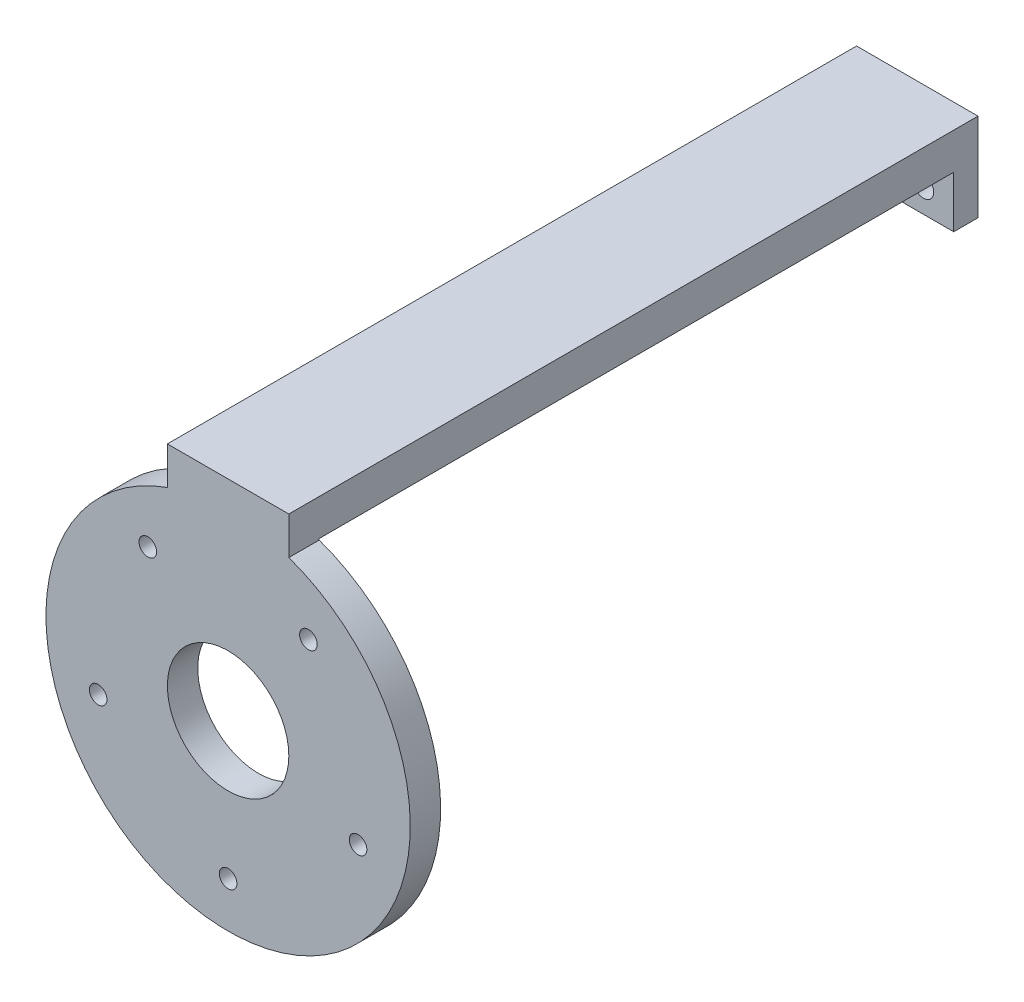
ISO-10303-21;
HEADER;
FILE_DESCRIPTION(('STEP AP214'),'2;1');
FILE_NAME('part.step','',(''),(''),'','','');
FILE_SCHEMA(('AUTOMOTIVE_DESIGN { 1 0 10303 214 1 1 1 1 }'));
ENDSEC;
DATA;
#1=APPLICATION_CONTEXT('core data for automotive mechanical design processes');
#2=APPLICATION_PROTOCOL_DEFINITION('international standard','automotive_design',2000,#1);
#3=PRODUCT_CONTEXT('',#1,'mechanical');
#4=PRODUCT('Part','Part','',(#3));
#5=PRODUCT_RELATED_PRODUCT_CATEGORY('part','',(#4));
#6=PRODUCT_DEFINITION_FORMATION('','',#4);
#7=PRODUCT_DEFINITION_CONTEXT('part definition',#1,'design');
#8=PRODUCT_DEFINITION('design','',#6,#7);
#9=PRODUCT_DEFINITION_SHAPE('','',#8);
#10=(LENGTH_UNIT() NAMED_UNIT(*) SI_UNIT(.MILLI.,.METRE.));
#11=(NAMED_UNIT(*) PLANE_ANGLE_UNIT() SI_UNIT($,.RADIAN.));
#12=(NAMED_UNIT(*) SI_UNIT($,.STERADIAN.) SOLID_ANGLE_UNIT());
#13=UNCERTAINTY_MEASURE_WITH_UNIT(LENGTH_MEASURE(1.E-05),#10,'distance_accuracy_value','');
#14=(GEOMETRIC_REPRESENTATION_CONTEXT(3) GLOBAL_UNCERTAINTY_ASSIGNED_CONTEXT((#13)) GLOBAL_UNIT_ASSIGNED_CONTEXT((#10,
#11,#12)) REPRESENTATION_CONTEXT('',''));
#15=CARTESIAN_POINT('',(0.,0.,0.));
#16=DIRECTION('',(0.,0.,1.));
#17=DIRECTION('',(1.,0.,0.));
#18=AXIS2_PLACEMENT_3D('',#15,#16,#17);
#19=CARTESIAN_POINT('',(300.,300.,389.5));
#20=DIRECTION('',(0.,0.,-1.));
#21=DIRECTION('',(-1.,0.,0.));
#22=AXIS2_PLACEMENT_3D('',#19,#20,#21);
#23=CYLINDRICAL_SURFACE('',#22,30.);
#24=DIRECTION('',(0.,0.,-1.));
#25=VECTOR('',#24,1.);
#26=CARTESIAN_POINT('',(290.,328.284271247462,389.5));
#27=LINE('',#26,#25);
#28=CARTESIAN_POINT('',(290.,328.284271247462,384.5));
#29=VERTEX_POINT('',#28);
#30=CARTESIAN_POINT('',(290.,328.284271247462,389.5));
#31=VERTEX_POINT('',#30);
#32=EDGE_CURVE('E46',#29,#31,#27,.F.);
#33=ORIENTED_EDGE('',*,*,#32,.F.);
#34=CARTESIAN_POINT('',(300.,300.,384.5));
#35=DIRECTION('',(0.,0.,1.));
#36=DIRECTION('',(1.,0.,0.));
#37=AXIS2_PLACEMENT_3D('',#34,#35,#36);
#38=CIRCLE('',#37,30.);
#39=CARTESIAN_POINT('',(310.,328.284271247462,384.5));
#40=VERTEX_POINT('',#39);
#41=EDGE_CURVE('E61',#29,#40,#38,.T.);
#42=ORIENTED_EDGE('',*,*,#41,.T.);
#43=DIRECTION('',(0.,0.,-1.));
#44=VECTOR('',#43,1.);
#45=CARTESIAN_POINT('',(310.,328.284271247462,389.5));
#46=LINE('',#45,#44);
#47=CARTESIAN_POINT('',(310.,328.284271247462,389.5));
#48=VERTEX_POINT('',#47);
#49=EDGE_CURVE('E198',#48,#40,#46,.T.);
#50=ORIENTED_EDGE('',*,*,#49,.F.);
#51=CARTESIAN_POINT('',(300.,300.,389.5));
#52=DIRECTION('',(0.,0.,1.));
#53=DIRECTION('',(1.,0.,0.));
#54=AXIS2_PLACEMENT_3D('',#51,#52,#53);
#55=CIRCLE('',#54,30.);
#56=EDGE_CURVE('E195',#31,#48,#55,.T.);
#57=ORIENTED_EDGE('',*,*,#56,.F.);
#58=EDGE_LOOP('',(#33,#42,#50,#57));
#59=FACE_BOUND('',#58,.T.);
#60=ADVANCED_FACE('F39',(#59),#23,.T.);
#61=CARTESIAN_POINT('',(300.,300.,389.5));
#62=DIRECTION('',(0.,0.,1.));
#63=DIRECTION('',(1.,0.,0.));
#64=AXIS2_PLACEMENT_3D('',#61,#62,#63);
#65=PLANE('',#64);
#66=DIRECTION('',(0.,1.,0.));
#67=VECTOR('',#66,1.);
#68=CARTESIAN_POINT('',(310.,320.,389.5));
#69=LINE('',#68,#67);
#70=CARTESIAN_POINT('',(310.,334.5,389.5));
#71=VERTEX_POINT('',#70);
#72=EDGE_CURVE('E147',#48,#71,#69,.T.);
#73=ORIENTED_EDGE('',*,*,#72,.T.);
#74=DIRECTION('',(-1.,0.,0.));
#75=VECTOR('',#74,1.);
#76=CARTESIAN_POINT('',(310.,334.5,389.5));
#77=LINE('',#76,#75);
#78=CARTESIAN_POINT('',(290.,334.5,389.5));
#79=VERTEX_POINT('',#78);
#80=EDGE_CURVE('E150',#71,#79,#77,.T.);
#81=ORIENTED_EDGE('',*,*,#80,.T.);
#82=DIRECTION('',(0.,-1.,0.));
#83=VECTOR('',#82,1.);
#84=CARTESIAN_POINT('',(290.,334.5,389.5));
#85=LINE('',#84,#83);
#86=EDGE_CURVE('E145',#79,#31,#85,.T.);
#87=ORIENTED_EDGE('',*,*,#86,.T.);
#88=ORIENTED_EDGE('',*,*,#56,.T.);
#89=EDGE_LOOP('',(#73,#81,#87,#88));
#90=FACE_BOUND('',#89,.T.);
#91=CARTESIAN_POINT('',(321.398771616641,293.047117626564,389.5));
#92=DIRECTION('',(0.,0.,1.));
#93=DIRECTION('',(1.,0.,0.));
#94=AXIS2_PLACEMENT_3D('',#91,#92,#93);
#95=CIRCLE('',#94,1.45000000000001);
#96=CARTESIAN_POINT('',(322.848771616641,293.047117626564,389.5));
#97=VERTEX_POINT('',#96);
#98=EDGE_CURVE('E166',#97,#97,#95,.T.);
#99=ORIENTED_EDGE('',*,*,#98,.F.);
#100=EDGE_LOOP('',(#99));
#101=FACE_BOUND('',#100,.T.);
#102=CARTESIAN_POINT('',(278.601228383359,293.047117626564,389.5));
#103=DIRECTION('',(0.,0.,1.));
#104=DIRECTION('',(1.,0.,0.));
#105=AXIS2_PLACEMENT_3D('',#102,#103,#104);
#106=CIRCLE('',#105,1.45000000000001);
#107=CARTESIAN_POINT('',(280.051228383359,293.047117626564,389.5));
#108=VERTEX_POINT('',#107);
#109=EDGE_CURVE('E178',#108,#108,#106,.T.);
#110=ORIENTED_EDGE('',*,*,#109,.F.);
#111=EDGE_LOOP('',(#110));
#112=FACE_BOUND('',#111,.T.);
#113=CARTESIAN_POINT('',(300.,300.,389.5));
#114=DIRECTION('',(0.,0.,1.));
#115=DIRECTION('',(1.,0.,0.));
#116=AXIS2_PLACEMENT_3D('',#113,#114,#115);
#117=CIRCLE('',#116,10.);
#118=CARTESIAN_POINT('',(310.,300.,389.5));
#119=VERTEX_POINT('',#118);
#120=EDGE_CURVE('E190',#119,#119,#117,.T.);
#121=ORIENTED_EDGE('',*,*,#120,.F.);
#122=EDGE_LOOP('',(#121));
#123=FACE_BOUND('',#122,.T.);
#124=CARTESIAN_POINT('',(286.774831823419,318.202882373436,389.5));
#125=DIRECTION('',(0.,0.,1.));
#126=DIRECTION('',(1.,0.,0.));
#127=AXIS2_PLACEMENT_3D('',#124,#125,#126);
#128=CIRCLE('',#127,1.45000000000001);
#129=CARTESIAN_POINT('',(288.224831823419,318.202882373436,389.5));
#130=VERTEX_POINT('',#129);
#131=EDGE_CURVE('E184',#130,#130,#128,.T.);
#132=ORIENTED_EDGE('',*,*,#131,.F.);
#133=EDGE_LOOP('',(#132));
#134=FACE_BOUND('',#133,.T.);
#135=CARTESIAN_POINT('',(300.,277.5,389.5));
#136=DIRECTION('',(0.,0.,1.));
#137=DIRECTION('',(1.,0.,0.));
#138=AXIS2_PLACEMENT_3D('',#135,#136,#137);
#139=CIRCLE('',#138,1.45000000000001);
#140=CARTESIAN_POINT('',(301.45,277.5,389.5));
#141=VERTEX_POINT('',#140);
#142=EDGE_CURVE('E172',#141,#141,#139,.T.);
#143=ORIENTED_EDGE('',*,*,#142,.F.);
#144=EDGE_LOOP('',(#143));
#145=FACE_BOUND('',#144,.T.);
#146=CARTESIAN_POINT('',(313.225168176581,318.202882373436,389.5));
#147=DIRECTION('',(0.,0.,1.));
#148=DIRECTION('',(1.,0.,0.));
#149=AXIS2_PLACEMENT_3D('',#146,#147,#148);
#150=CIRCLE('',#149,1.45000000000001);
#151=CARTESIAN_POINT('',(314.675168176581,318.202882373436,389.5));
#152=VERTEX_POINT('',#151);
#153=EDGE_CURVE('E160',#152,#152,#150,.T.);
#154=ORIENTED_EDGE('',*,*,#153,.F.);
#155=EDGE_LOOP('',(#154));
#156=FACE_BOUND('',#155,.T.);
#157=ADVANCED_FACE('F206',(#90,#101,#112,#123,#134,#145,#156),#65,.T.);
#158=CARTESIAN_POINT('',(300.,300.,384.5));
#159=DIRECTION('',(0.,0.,1.));
#160=DIRECTION('',(1.,0.,0.));
#161=AXIS2_PLACEMENT_3D('',#158,#159,#160);
#162=PLANE('',#161);
#163=DIRECTION('',(0.,-1.,0.));
#164=VECTOR('',#163,1.);
#165=CARTESIAN_POINT('',(290.,334.5,384.5));
#166=LINE('',#165,#164);
#167=CARTESIAN_POINT('',(290.,328.5,384.5));
#168=VERTEX_POINT('',#167);
#169=EDGE_CURVE('E144',#168,#29,#166,.T.);
#170=ORIENTED_EDGE('',*,*,#169,.F.);
#171=DIRECTION('',(1.,0.,0.));
#172=VECTOR('',#171,1.);
#173=CARTESIAN_POINT('',(300.,328.5,384.5));
#174=LINE('',#173,#172);
#175=CARTESIAN_POINT('',(310.,328.5,384.5));
#176=VERTEX_POINT('',#175);
#177=EDGE_CURVE('E142',#168,#176,#174,.T.);
#178=ORIENTED_EDGE('',*,*,#177,.T.);
#179=DIRECTION('',(0.,1.,0.));
#180=VECTOR('',#179,1.);
#181=CARTESIAN_POINT('',(310.,320.,384.5));
#182=LINE('',#181,#180);
#183=EDGE_CURVE('E148',#40,#176,#182,.T.);
#184=ORIENTED_EDGE('',*,*,#183,.F.);
#185=ORIENTED_EDGE('',*,*,#41,.F.);
#186=EDGE_LOOP('',(#170,#178,#184,#185));
#187=FACE_BOUND('',#186,.T.);
#188=CARTESIAN_POINT('',(313.225168176581,318.202882373436,384.5));
#189=DIRECTION('',(0.,0.,1.));
#190=DIRECTION('',(1.,0.,0.));
#191=AXIS2_PLACEMENT_3D('',#188,#189,#190);
#192=CIRCLE('',#191,1.45000000000001);
#193=CARTESIAN_POINT('',(314.675168176581,318.202882373436,384.5));
#194=VERTEX_POINT('',#193);
#195=EDGE_CURVE('E159',#194,#194,#192,.T.);
#196=ORIENTED_EDGE('',*,*,#195,.T.);
#197=EDGE_LOOP('',(#196));
#198=FACE_BOUND('',#197,.T.);
#199=CARTESIAN_POINT('',(321.398771616641,293.047117626564,384.5));
#200=DIRECTION('',(0.,0.,1.));
#201=DIRECTION('',(1.,0.,0.));
#202=AXIS2_PLACEMENT_3D('',#199,#200,#201);
#203=CIRCLE('',#202,1.45000000000001);
#204=CARTESIAN_POINT('',(322.848771616641,293.047117626564,384.5));
#205=VERTEX_POINT('',#204);
#206=EDGE_CURVE('E163',#205,#205,#203,.T.);
#207=ORIENTED_EDGE('',*,*,#206,.T.);
#208=EDGE_LOOP('',(#207));
#209=FACE_BOUND('',#208,.T.);
#210=CARTESIAN_POINT('',(300.,277.5,384.5));
#211=DIRECTION('',(0.,0.,1.));
#212=DIRECTION('',(1.,0.,0.));
#213=AXIS2_PLACEMENT_3D('',#210,#211,#212);
#214=CIRCLE('',#213,1.45000000000001);
#215=CARTESIAN_POINT('',(301.45,277.5,384.5));
#216=VERTEX_POINT('',#215);
#217=EDGE_CURVE('E169',#216,#216,#214,.T.);
#218=ORIENTED_EDGE('',*,*,#217,.T.);
#219=EDGE_LOOP('',(#218));
#220=FACE_BOUND('',#219,.T.);
#221=CARTESIAN_POINT('',(278.601228383359,293.047117626564,384.5));
#222=DIRECTION('',(0.,0.,1.));
#223=DIRECTION('',(1.,0.,0.));
#224=AXIS2_PLACEMENT_3D('',#221,#222,#223);
#225=CIRCLE('',#224,1.45000000000001);
#226=CARTESIAN_POINT('',(280.051228383359,293.047117626564,384.5));
#227=VERTEX_POINT('',#226);
#228=EDGE_CURVE('E175',#227,#227,#225,.T.);
#229=ORIENTED_EDGE('',*,*,#228,.T.);
#230=EDGE_LOOP('',(#229));
#231=FACE_BOUND('',#230,.T.);
#232=CARTESIAN_POINT('',(286.774831823419,318.202882373436,384.5));
#233=DIRECTION('',(0.,0.,1.));
#234=DIRECTION('',(1.,0.,0.));
#235=AXIS2_PLACEMENT_3D('',#232,#233,#234);
#236=CIRCLE('',#235,1.45000000000001);
#237=CARTESIAN_POINT('',(288.224831823419,318.202882373436,384.5));
#238=VERTEX_POINT('',#237);
#239=EDGE_CURVE('E181',#238,#238,#236,.T.);
#240=ORIENTED_EDGE('',*,*,#239,.T.);
#241=EDGE_LOOP('',(#240));
#242=FACE_BOUND('',#241,.T.);
#243=CARTESIAN_POINT('',(300.,300.,384.5));
#244=DIRECTION('',(0.,0.,1.));
#245=DIRECTION('',(1.,0.,0.));
#246=AXIS2_PLACEMENT_3D('',#243,#244,#245);
#247=CIRCLE('',#246,10.);
#248=CARTESIAN_POINT('',(310.,300.,384.5));
#249=VERTEX_POINT('',#248);
#250=EDGE_CURVE('E187',#249,#249,#247,.T.);
#251=ORIENTED_EDGE('',*,*,#250,.T.);
#252=EDGE_LOOP('',(#251));
#253=FACE_BOUND('',#252,.T.);
#254=ADVANCED_FACE('F256',(#187,#198,#209,#220,#231,#242,#253),#162,.F.);
#255=CARTESIAN_POINT('',(300.,300.,389.5));
#256=DIRECTION('',(0.,0.,-1.));
#257=DIRECTION('',(-1.,0.,0.));
#258=AXIS2_PLACEMENT_3D('',#255,#256,#257);
#259=CYLINDRICAL_SURFACE('',#258,10.);
#260=ORIENTED_EDGE('',*,*,#120,.T.);
#261=EDGE_LOOP('',(#260));
#262=FACE_BOUND('',#261,.T.);
#263=ORIENTED_EDGE('',*,*,#250,.F.);
#264=EDGE_LOOP('',(#263));
#265=FACE_BOUND('',#264,.T.);
#266=ADVANCED_FACE('F261',(#262,#265),#259,.F.);
#267=CARTESIAN_POINT('',(286.774831823419,318.202882373436,389.5));
#268=DIRECTION('',(0.,0.,-1.));
#269=DIRECTION('',(-1.,0.,0.));
#270=AXIS2_PLACEMENT_3D('',#267,#268,#269);
#271=CYLINDRICAL_SURFACE('',#270,1.45000000000001);
#272=ORIENTED_EDGE('',*,*,#131,.T.);
#273=EDGE_LOOP('',(#272));
#274=FACE_BOUND('',#273,.T.);
#275=ORIENTED_EDGE('',*,*,#239,.F.);
#276=EDGE_LOOP('',(#275));
#277=FACE_BOUND('',#276,.T.);
#278=ADVANCED_FACE('F266',(#274,#277),#271,.F.);
#279=CARTESIAN_POINT('',(278.601228383359,293.047117626564,389.5));
#280=DIRECTION('',(0.,0.,-1.));
#281=DIRECTION('',(-1.,0.,0.));
#282=AXIS2_PLACEMENT_3D('',#279,#280,#281);
#283=CYLINDRICAL_SURFACE('',#282,1.45000000000001);
#284=ORIENTED_EDGE('',*,*,#109,.T.);
#285=EDGE_LOOP('',(#284));
#286=FACE_BOUND('',#285,.T.);
#287=ORIENTED_EDGE('',*,*,#228,.F.);
#288=EDGE_LOOP('',(#287));
#289=FACE_BOUND('',#288,.T.);
#290=ADVANCED_FACE('F270',(#286,#289),#283,.F.);
#291=CARTESIAN_POINT('',(300.,277.5,389.5));
#292=DIRECTION('',(0.,0.,-1.));
#293=DIRECTION('',(-1.,0.,0.));
#294=AXIS2_PLACEMENT_3D('',#291,#292,#293);
#295=CYLINDRICAL_SURFACE('',#294,1.45000000000001);
#296=ORIENTED_EDGE('',*,*,#142,.T.);
#297=EDGE_LOOP('',(#296));
#298=FACE_BOUND('',#297,.T.);
#299=ORIENTED_EDGE('',*,*,#217,.F.);
#300=EDGE_LOOP('',(#299));
#301=FACE_BOUND('',#300,.T.);
#302=ADVANCED_FACE('F274',(#298,#301),#295,.F.);
#303=CARTESIAN_POINT('',(321.398771616641,293.047117626564,389.5));
#304=DIRECTION('',(0.,0.,-1.));
#305=DIRECTION('',(-1.,0.,0.));
#306=AXIS2_PLACEMENT_3D('',#303,#304,#305);
#307=CYLINDRICAL_SURFACE('',#306,1.45000000000001);
#308=ORIENTED_EDGE('',*,*,#98,.T.);
#309=EDGE_LOOP('',(#308));
#310=FACE_BOUND('',#309,.T.);
#311=ORIENTED_EDGE('',*,*,#206,.F.);
#312=EDGE_LOOP('',(#311));
#313=FACE_BOUND('',#312,.T.);
#314=ADVANCED_FACE('F278',(#310,#313),#307,.F.);
#315=CARTESIAN_POINT('',(313.225168176581,318.202882373436,389.5));
#316=DIRECTION('',(0.,0.,-1.));
#317=DIRECTION('',(-1.,0.,0.));
#318=AXIS2_PLACEMENT_3D('',#315,#316,#317);
#319=CYLINDRICAL_SURFACE('',#318,1.45000000000001);
#320=ORIENTED_EDGE('',*,*,#153,.T.);
#321=EDGE_LOOP('',(#320));
#322=FACE_BOUND('',#321,.T.);
#323=ORIENTED_EDGE('',*,*,#195,.F.);
#324=EDGE_LOOP('',(#323));
#325=FACE_BOUND('',#324,.T.);
#326=ADVANCED_FACE('F282',(#322,#325),#319,.F.);
#327=CARTESIAN_POINT('',(290.,334.5,389.5));
#328=DIRECTION('',(1.,0.,0.));
#329=DIRECTION('',(0.,0.,-1.));
#330=AXIS2_PLACEMENT_3D('',#327,#328,#329);
#331=PLANE('',#330);
#332=DIRECTION('',(0.,0.,-1.));
#333=VECTOR('',#332,1.);
#334=CARTESIAN_POINT('',(290.,334.5,389.5));
#335=LINE('',#334,#333);
#336=CARTESIAN_POINT('',(290.,334.5,276.));
#337=VERTEX_POINT('',#336);
#338=EDGE_CURVE('E152',#79,#337,#335,.T.);
#339=ORIENTED_EDGE('',*,*,#338,.T.);
#340=DIRECTION('',(0.,-1.,0.));
#341=VECTOR('',#340,1.);
#342=CARTESIAN_POINT('',(290.,334.5,276.));
#343=LINE('',#342,#341);
#344=CARTESIAN_POINT('',(290.,320.,276.));
#345=VERTEX_POINT('',#344);
#346=EDGE_CURVE('E127',#337,#345,#343,.T.);
#347=ORIENTED_EDGE('',*,*,#346,.T.);
#348=DIRECTION('',(0.,0.,-1.));
#349=VECTOR('',#348,1.);
#350=CARTESIAN_POINT('',(290.,320.,280.));
#351=LINE('',#350,#349);
#352=CARTESIAN_POINT('',(290.,320.,280.));
#353=VERTEX_POINT('',#352);
#354=EDGE_CURVE('E119',#353,#345,#351,.T.);
#355=ORIENTED_EDGE('',*,*,#354,.F.);
#356=DIRECTION('',(0.,-1.,0.));
#357=VECTOR('',#356,1.);
#358=CARTESIAN_POINT('',(290.,334.5,280.));
#359=LINE('',#358,#357);
#360=CARTESIAN_POINT('',(290.,328.5,280.));
#361=VERTEX_POINT('',#360);
#362=EDGE_CURVE('E104',#361,#353,#359,.T.);
#363=ORIENTED_EDGE('',*,*,#362,.F.);
#364=DIRECTION('',(0.,0.,1.));
#365=VECTOR('',#364,1.);
#366=CARTESIAN_POINT('',(290.,328.5,389.5));
#367=LINE('',#366,#365);
#368=EDGE_CURVE('E129',#361,#168,#367,.T.);
#369=ORIENTED_EDGE('',*,*,#368,.T.);
#370=ORIENTED_EDGE('',*,*,#169,.T.);
#371=ORIENTED_EDGE('',*,*,#32,.T.);
#372=ORIENTED_EDGE('',*,*,#86,.F.);
#373=EDGE_LOOP('',(#339,#347,#355,#363,#369,#370,#371,#372));
#374=FACE_BOUND('',#373,.T.);
#375=ADVANCED_FACE('F125',(#374),#331,.F.);
#376=CARTESIAN_POINT('',(310.,320.,389.5));
#377=DIRECTION('',(-1.,0.,0.));
#378=DIRECTION('',(0.,0.,1.));
#379=AXIS2_PLACEMENT_3D('',#376,#377,#378);
#380=PLANE('',#379);
#381=DIRECTION('',(0.,0.,-1.));
#382=VECTOR('',#381,1.);
#383=CARTESIAN_POINT('',(310.,328.5,276.));
#384=LINE('',#383,#382);
#385=CARTESIAN_POINT('',(310.,328.5,280.));
#386=VERTEX_POINT('',#385);
#387=EDGE_CURVE('E53',#176,#386,#384,.T.);
#388=ORIENTED_EDGE('',*,*,#387,.T.);
#389=DIRECTION('',(0.,1.,0.));
#390=VECTOR('',#389,1.);
#391=CARTESIAN_POINT('',(310.,320.,280.));
#392=LINE('',#391,#390);
#393=CARTESIAN_POINT('',(310.,320.,280.));
#394=VERTEX_POINT('',#393);
#395=EDGE_CURVE('E123',#394,#386,#392,.T.);
#396=ORIENTED_EDGE('',*,*,#395,.F.);
#397=DIRECTION('',(0.,0.,-1.));
#398=VECTOR('',#397,1.);
#399=CARTESIAN_POINT('',(310.,320.,280.));
#400=LINE('',#399,#398);
#401=CARTESIAN_POINT('',(310.,320.,276.));
#402=VERTEX_POINT('',#401);
#403=EDGE_CURVE('E121',#394,#402,#400,.T.);
#404=ORIENTED_EDGE('',*,*,#403,.T.);
#405=DIRECTION('',(0.,-1.,0.));
#406=VECTOR('',#405,1.);
#407=CARTESIAN_POINT('',(310.,334.5,276.));
#408=LINE('',#407,#406);
#409=CARTESIAN_POINT('',(310.,334.5,276.));
#410=VERTEX_POINT('',#409);
#411=EDGE_CURVE('E140',#410,#402,#408,.T.);
#412=ORIENTED_EDGE('',*,*,#411,.F.);
#413=DIRECTION('',(0.,0.,-1.));
#414=VECTOR('',#413,1.);
#415=CARTESIAN_POINT('',(310.,334.5,389.5));
#416=LINE('',#415,#414);
#417=EDGE_CURVE('E157',#71,#410,#416,.T.);
#418=ORIENTED_EDGE('',*,*,#417,.F.);
#419=ORIENTED_EDGE('',*,*,#72,.F.);
#420=ORIENTED_EDGE('',*,*,#49,.T.);
#421=ORIENTED_EDGE('',*,*,#183,.T.);
#422=EDGE_LOOP('',(#388,#396,#404,#412,#418,#419,#420,#421));
#423=FACE_BOUND('',#422,.T.);
#424=ADVANCED_FACE('F210',(#423),#380,.F.);
#425=CARTESIAN_POINT('',(310.,334.5,389.5));
#426=DIRECTION('',(0.,-1.,0.));
#427=DIRECTION('',(0.,0.,-1.));
#428=AXIS2_PLACEMENT_3D('',#425,#426,#427);
#429=PLANE('',#428);
#430=ORIENTED_EDGE('',*,*,#417,.T.);
#431=DIRECTION('',(-1.,0.,0.));
#432=VECTOR('',#431,1.);
#433=CARTESIAN_POINT('',(290.,334.5,276.));
#434=LINE('',#433,#432);
#435=EDGE_CURVE('E135',#410,#337,#434,.T.);
#436=ORIENTED_EDGE('',*,*,#435,.T.);
#437=ORIENTED_EDGE('',*,*,#338,.F.);
#438=ORIENTED_EDGE('',*,*,#80,.F.);
#439=EDGE_LOOP('',(#430,#436,#437,#438));
#440=FACE_BOUND('',#439,.T.);
#441=ADVANCED_FACE('F217',(#440),#429,.F.);
#442=CARTESIAN_POINT('',(0.,328.5,0.));
#443=DIRECTION('',(0.,-1.,0.));
#444=DIRECTION('',(0.,0.,-1.));
#445=AXIS2_PLACEMENT_3D('',#442,#443,#444);
#446=PLANE('',#445);
#447=DIRECTION('',(-1.,0.,0.));
#448=VECTOR('',#447,1.);
#449=CARTESIAN_POINT('',(0.,328.5,280.));
#450=LINE('',#449,#448);
#451=EDGE_CURVE('E11',#386,#361,#450,.T.);
#452=ORIENTED_EDGE('',*,*,#451,.F.);
#453=ORIENTED_EDGE('',*,*,#387,.F.);
#454=ORIENTED_EDGE('',*,*,#177,.F.);
#455=ORIENTED_EDGE('',*,*,#368,.F.);
#456=EDGE_LOOP('',(#452,#453,#454,#455));
#457=FACE_BOUND('',#456,.T.);
#458=ADVANCED_FACE('F247',(#457),#446,.T.);
#459=CARTESIAN_POINT('',(290.,334.5,276.));
#460=DIRECTION('',(0.,0.,1.));
#461=DIRECTION('',(1.,0.,0.));
#462=AXIS2_PLACEMENT_3D('',#459,#460,#461);
#463=PLANE('',#462);
#464=ORIENTED_EDGE('',*,*,#411,.T.);
#465=DIRECTION('',(1.,0.,0.));
#466=VECTOR('',#465,1.);
#467=CARTESIAN_POINT('',(290.,320.,276.));
#468=LINE('',#467,#466);
#469=EDGE_CURVE('E113',#345,#402,#468,.T.);
#470=ORIENTED_EDGE('',*,*,#469,.F.);
#471=ORIENTED_EDGE('',*,*,#346,.F.);
#472=ORIENTED_EDGE('',*,*,#435,.F.);
#473=EDGE_LOOP('',(#464,#470,#471,#472));
#474=FACE_BOUND('',#473,.T.);
#475=CARTESIAN_POINT('',(295.,324.,276.));
#476=DIRECTION('',(0.,0.,1.));
#477=DIRECTION('',(1.,0.,0.));
#478=AXIS2_PLACEMENT_3D('',#475,#476,#477);
#479=CIRCLE('',#478,1.69999999999998);
#480=CARTESIAN_POINT('',(296.7,324.,276.));
#481=VERTEX_POINT('',#480);
#482=EDGE_CURVE('E223',#481,#481,#479,.T.);
#483=ORIENTED_EDGE('',*,*,#482,.T.);
#484=EDGE_LOOP('',(#483));
#485=FACE_BOUND('',#484,.T.);
#486=CARTESIAN_POINT('',(305.,324.,276.));
#487=DIRECTION('',(0.,0.,1.));
#488=DIRECTION('',(1.,0.,0.));
#489=AXIS2_PLACEMENT_3D('',#486,#487,#488);
#490=CIRCLE('',#489,1.69999999999998);
#491=CARTESIAN_POINT('',(306.7,324.,276.));
#492=VERTEX_POINT('',#491);
#493=EDGE_CURVE('E230',#492,#492,#490,.T.);
#494=ORIENTED_EDGE('',*,*,#493,.T.);
#495=EDGE_LOOP('',(#494));
#496=FACE_BOUND('',#495,.T.);
#497=ADVANCED_FACE('F219',(#474,#485,#496),#463,.F.);
#498=CARTESIAN_POINT('',(0.,0.,280.));
#499=DIRECTION('',(0.,0.,1.));
#500=DIRECTION('',(1.,0.,0.));
#501=AXIS2_PLACEMENT_3D('',#498,#499,#500);
#502=PLANE('',#501);
#503=CARTESIAN_POINT('',(295.,324.,280.));
#504=DIRECTION('',(0.,0.,1.));
#505=DIRECTION('',(1.,0.,0.));
#506=AXIS2_PLACEMENT_3D('',#503,#504,#505);
#507=CIRCLE('',#506,1.69999999999998);
#508=CARTESIAN_POINT('',(296.7,324.,280.));
#509=VERTEX_POINT('',#508);
#510=EDGE_CURVE('E221',#509,#509,#507,.T.);
#511=ORIENTED_EDGE('',*,*,#510,.F.);
#512=EDGE_LOOP('',(#511));
#513=FACE_BOUND('',#512,.T.);
#514=ORIENTED_EDGE('',*,*,#395,.T.);
#515=ORIENTED_EDGE('',*,*,#451,.T.);
#516=ORIENTED_EDGE('',*,*,#362,.T.);
#517=DIRECTION('',(1.,0.,0.));
#518=VECTOR('',#517,1.);
#519=CARTESIAN_POINT('',(290.,320.,280.));
#520=LINE('',#519,#518);
#521=EDGE_CURVE('E108',#353,#394,#520,.T.);
#522=ORIENTED_EDGE('',*,*,#521,.T.);
#523=EDGE_LOOP('',(#514,#515,#516,#522));
#524=FACE_BOUND('',#523,.T.);
#525=CARTESIAN_POINT('',(305.,324.,280.));
#526=DIRECTION('',(0.,0.,1.));
#527=DIRECTION('',(1.,0.,0.));
#528=AXIS2_PLACEMENT_3D('',#525,#526,#527);
#529=CIRCLE('',#528,1.69999999999998);
#530=CARTESIAN_POINT('',(306.7,324.,280.));
#531=VERTEX_POINT('',#530);
#532=EDGE_CURVE('E228',#531,#531,#529,.T.);
#533=ORIENTED_EDGE('',*,*,#532,.F.);
#534=EDGE_LOOP('',(#533));
#535=FACE_BOUND('',#534,.T.);
#536=ADVANCED_FACE('F106',(#513,#524,#535),#502,.T.);
#537=CARTESIAN_POINT('',(290.,320.,280.));
#538=DIRECTION('',(0.,1.,0.));
#539=DIRECTION('',(0.,0.,1.));
#540=AXIS2_PLACEMENT_3D('',#537,#538,#539);
#541=PLANE('',#540);
#542=ORIENTED_EDGE('',*,*,#469,.T.);
#543=ORIENTED_EDGE('',*,*,#403,.F.);
#544=ORIENTED_EDGE('',*,*,#521,.F.);
#545=ORIENTED_EDGE('',*,*,#354,.T.);
#546=EDGE_LOOP('',(#542,#543,#544,#545));
#547=FACE_BOUND('',#546,.T.);
#548=ADVANCED_FACE('F118',(#547),#541,.F.);
#549=CARTESIAN_POINT('',(295.,324.,280.));
#550=DIRECTION('',(0.,0.,-1.));
#551=DIRECTION('',(-1.,0.,0.));
#552=AXIS2_PLACEMENT_3D('',#549,#550,#551);
#553=CYLINDRICAL_SURFACE('',#552,1.69999999999998);
#554=ORIENTED_EDGE('',*,*,#510,.T.);
#555=EDGE_LOOP('',(#554));
#556=FACE_BOUND('',#555,.T.);
#557=ORIENTED_EDGE('',*,*,#482,.F.);
#558=EDGE_LOOP('',(#557));
#559=FACE_BOUND('',#558,.T.);
#560=ADVANCED_FACE('F245',(#556,#559),#553,.F.);
#561=CARTESIAN_POINT('',(305.,324.,280.));
#562=DIRECTION('',(0.,0.,-1.));
#563=DIRECTION('',(-1.,0.,0.));
#564=AXIS2_PLACEMENT_3D('',#561,#562,#563);
#565=CYLINDRICAL_SURFACE('',#564,1.69999999999998);
#566=ORIENTED_EDGE('',*,*,#532,.T.);
#567=EDGE_LOOP('',(#566));
#568=FACE_BOUND('',#567,.T.);
#569=ORIENTED_EDGE('',*,*,#493,.F.);
#570=EDGE_LOOP('',(#569));
#571=FACE_BOUND('',#570,.T.);
#572=ADVANCED_FACE('F236',(#568,#571),#565,.F.);
#573=CLOSED_SHELL('',(#60,#157,#254,#266,#278,#290,#302,#314,#326,#375,#424,#441,#458,#497,#536,
#548,#560,#572));
#574=MANIFOLD_SOLID_BREP('B2',#573);
#575=ADVANCED_BREP_SHAPE_REPRESENTATION('',(#18,#574),#14);
#576=SHAPE_DEFINITION_REPRESENTATION(#9,#575);
ENDSEC;
END-ISO-10303-21;
